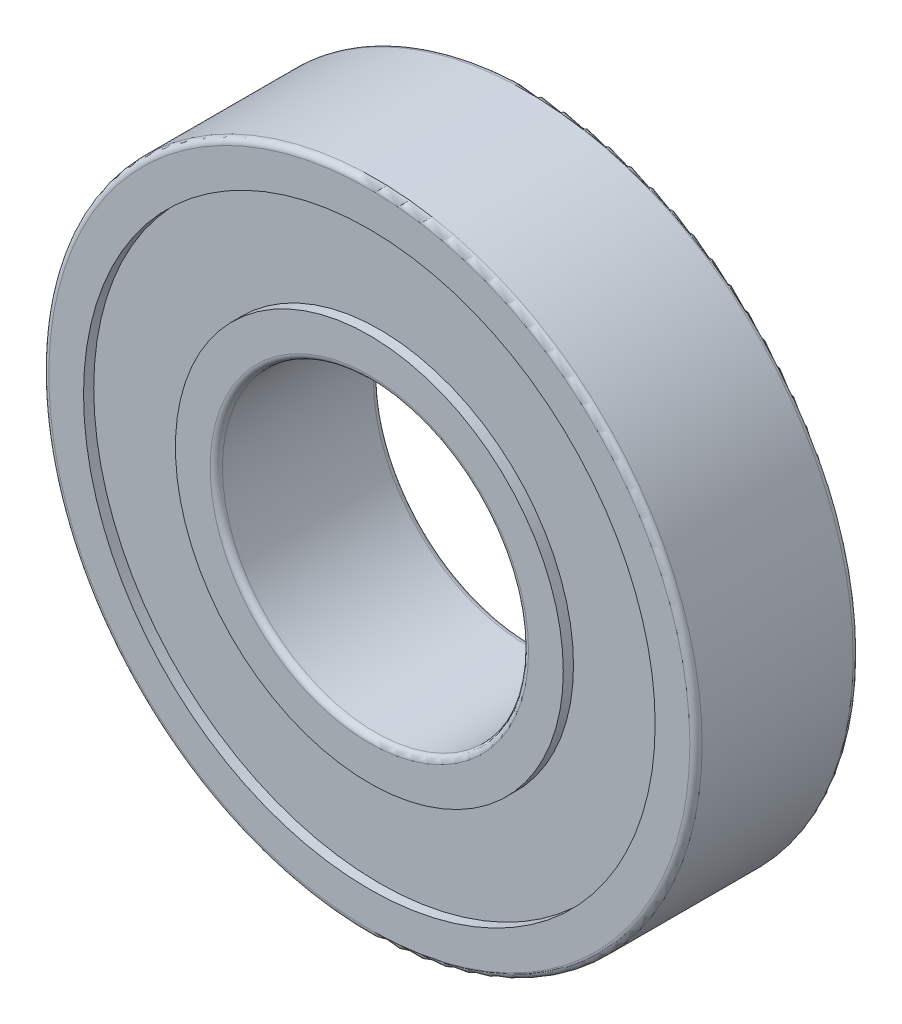
ISO-10303-21;
HEADER;
FILE_DESCRIPTION(('STEP AP214'),'2;1');
FILE_NAME('part.step','',(''),(''),'','','');
FILE_SCHEMA(('AUTOMOTIVE_DESIGN { 1 0 10303 214 1 1 1 1 }'));
ENDSEC;
DATA;
#1=APPLICATION_CONTEXT('core data for automotive mechanical design processes');
#2=APPLICATION_PROTOCOL_DEFINITION('international standard','automotive_design',2000,#1);
#3=PRODUCT_CONTEXT('',#1,'mechanical');
#4=PRODUCT('Part','Part','',(#3));
#5=PRODUCT_RELATED_PRODUCT_CATEGORY('part','',(#4));
#6=PRODUCT_DEFINITION_FORMATION('','',#4);
#7=PRODUCT_DEFINITION_CONTEXT('part definition',#1,'design');
#8=PRODUCT_DEFINITION('design','',#6,#7);
#9=PRODUCT_DEFINITION_SHAPE('','',#8);
#10=(LENGTH_UNIT() NAMED_UNIT(*) SI_UNIT(.MILLI.,.METRE.));
#11=(NAMED_UNIT(*) PLANE_ANGLE_UNIT() SI_UNIT($,.RADIAN.));
#12=(NAMED_UNIT(*) SI_UNIT($,.STERADIAN.) SOLID_ANGLE_UNIT());
#13=UNCERTAINTY_MEASURE_WITH_UNIT(LENGTH_MEASURE(1.E-05),#10,'distance_accuracy_value','');
#14=(GEOMETRIC_REPRESENTATION_CONTEXT(3) GLOBAL_UNCERTAINTY_ASSIGNED_CONTEXT((#13)) GLOBAL_UNIT_ASSIGNED_CONTEXT((#10,
#11,#12)) REPRESENTATION_CONTEXT('',''));
#15=CARTESIAN_POINT('',(0.,0.,0.));
#16=DIRECTION('',(0.,0.,1.));
#17=DIRECTION('',(1.,0.,0.));
#18=AXIS2_PLACEMENT_3D('',#15,#16,#17);
#19=CARTESIAN_POINT('',(0.,0.,-4.));
#20=DIRECTION('',(0.,0.,1.));
#21=DIRECTION('',(1.,0.,0.));
#22=AXIS2_PLACEMENT_3D('',#19,#20,#21);
#23=PLANE('',#22);
#24=CARTESIAN_POINT('',(0.,0.,-4.));
#25=DIRECTION('',(0.,0.,1.));
#26=DIRECTION('',(1.,0.,0.));
#27=AXIS2_PLACEMENT_3D('',#24,#25,#26);
#28=CIRCLE('',#27,7.8);
#29=CARTESIAN_POINT('',(7.8,0.,-4.));
#30=VERTEX_POINT('',#29);
#31=EDGE_CURVE('E92',#30,#30,#28,.T.);
#32=ORIENTED_EDGE('',*,*,#31,.T.);
#33=EDGE_LOOP('',(#32));
#34=FACE_BOUND('',#33,.T.);
#35=CARTESIAN_POINT('',(0.,0.,-4.));
#36=DIRECTION('',(0.,0.,1.));
#37=DIRECTION('',(1.,0.,0.));
#38=AXIS2_PLACEMENT_3D('',#35,#36,#37);
#39=CIRCLE('',#38,9.5);
#40=CARTESIAN_POINT('',(9.5,0.,-4.));
#41=VERTEX_POINT('',#40);
#42=EDGE_CURVE('E68',#41,#41,#39,.T.);
#43=ORIENTED_EDGE('',*,*,#42,.F.);
#44=EDGE_LOOP('',(#43));
#45=FACE_BOUND('',#44,.T.);
#46=ADVANCED_FACE('F57',(#34,#45),#23,.F.);
#47=CARTESIAN_POINT('',(0.,0.,-3.5));
#48=DIRECTION('',(0.,0.,-1.));
#49=DIRECTION('',(1.,0.,0.));
#50=AXIS2_PLACEMENT_3D('',#47,#48,#49);
#51=CYLINDRICAL_SURFACE('',#50,14.);
#52=CARTESIAN_POINT('',(0.,0.,-3.5));
#53=DIRECTION('',(0.,0.,1.));
#54=DIRECTION('',(1.,0.,0.));
#55=AXIS2_PLACEMENT_3D('',#52,#53,#54);
#56=CIRCLE('',#55,14.);
#57=CARTESIAN_POINT('',(14.,0.,-3.5));
#58=VERTEX_POINT('',#57);
#59=EDGE_CURVE('E64',#58,#58,#56,.T.);
#60=ORIENTED_EDGE('',*,*,#59,.T.);
#61=EDGE_LOOP('',(#60));
#62=FACE_BOUND('',#61,.T.);
#63=CARTESIAN_POINT('',(0.,0.,-4.));
#64=DIRECTION('',(0.,0.,1.));
#65=DIRECTION('',(1.,0.,0.));
#66=AXIS2_PLACEMENT_3D('',#63,#64,#65);
#67=CIRCLE('',#66,14.);
#68=CARTESIAN_POINT('',(14.,0.,-4.));
#69=VERTEX_POINT('',#68);
#70=EDGE_CURVE('E12',#69,#69,#67,.T.);
#71=ORIENTED_EDGE('',*,*,#70,.F.);
#72=EDGE_LOOP('',(#71));
#73=FACE_BOUND('',#72,.T.);
#74=ADVANCED_FACE('F59',(#62,#73),#51,.F.);
#75=CARTESIAN_POINT('',(0.,0.,-3.5));
#76=DIRECTION('',(0.,0.,-1.));
#77=DIRECTION('',(1.,0.,0.));
#78=AXIS2_PLACEMENT_3D('',#75,#76,#77);
#79=PLANE('',#78);
#80=CARTESIAN_POINT('',(0.,0.,-3.5));
#81=DIRECTION('',(0.,0.,1.));
#82=DIRECTION('',(1.,0.,0.));
#83=AXIS2_PLACEMENT_3D('',#80,#81,#82);
#84=CIRCLE('',#83,9.5);
#85=CARTESIAN_POINT('',(9.5,0.,-3.5));
#86=VERTEX_POINT('',#85);
#87=EDGE_CURVE('E72',#86,#86,#84,.T.);
#88=ORIENTED_EDGE('',*,*,#87,.T.);
#89=EDGE_LOOP('',(#88));
#90=FACE_BOUND('',#89,.T.);
#91=ORIENTED_EDGE('',*,*,#59,.F.);
#92=EDGE_LOOP('',(#91));
#93=FACE_BOUND('',#92,.T.);
#94=ADVANCED_FACE('F150',(#90,#93),#79,.T.);
#95=CARTESIAN_POINT('',(0.,0.,-3.5));
#96=DIRECTION('',(0.,0.,-1.));
#97=DIRECTION('',(1.,0.,0.));
#98=AXIS2_PLACEMENT_3D('',#95,#96,#97);
#99=CYLINDRICAL_SURFACE('',#98,9.5);
#100=ORIENTED_EDGE('',*,*,#87,.F.);
#101=EDGE_LOOP('',(#100));
#102=FACE_BOUND('',#101,.T.);
#103=ORIENTED_EDGE('',*,*,#42,.T.);
#104=EDGE_LOOP('',(#103));
#105=FACE_BOUND('',#104,.T.);
#106=ADVANCED_FACE('F142',(#102,#105),#99,.T.);
#107=CARTESIAN_POINT('',(0.,0.,4.));
#108=DIRECTION('',(0.,0.,1.));
#109=DIRECTION('',(1.,0.,0.));
#110=AXIS2_PLACEMENT_3D('',#107,#108,#109);
#111=PLANE('',#110);
#112=CARTESIAN_POINT('',(0.,0.,4.));
#113=DIRECTION('',(0.,0.,1.));
#114=DIRECTION('',(1.,0.,0.));
#115=AXIS2_PLACEMENT_3D('',#112,#113,#114);
#116=CIRCLE('',#115,7.8);
#117=CARTESIAN_POINT('',(7.8,0.,4.));
#118=VERTEX_POINT('',#117);
#119=EDGE_CURVE('E80',#118,#118,#116,.F.);
#120=ORIENTED_EDGE('',*,*,#119,.T.);
#121=EDGE_LOOP('',(#120));
#122=FACE_BOUND('',#121,.T.);
#123=CARTESIAN_POINT('',(0.,0.,4.));
#124=DIRECTION('',(0.,0.,1.));
#125=DIRECTION('',(1.,0.,0.));
#126=AXIS2_PLACEMENT_3D('',#123,#124,#125);
#127=CIRCLE('',#126,9.5);
#128=CARTESIAN_POINT('',(9.5,0.,4.));
#129=VERTEX_POINT('',#128);
#130=EDGE_CURVE('E108',#129,#129,#127,.T.);
#131=ORIENTED_EDGE('',*,*,#130,.T.);
#132=EDGE_LOOP('',(#131));
#133=FACE_BOUND('',#132,.T.);
#134=ADVANCED_FACE('F133',(#122,#133),#111,.T.);
#135=CARTESIAN_POINT('',(0.,0.,4.));
#136=DIRECTION('',(0.,0.,1.));
#137=DIRECTION('',(1.,0.,0.));
#138=AXIS2_PLACEMENT_3D('',#135,#136,#137);
#139=CIRCLE('',#138,15.7);
#140=CARTESIAN_POINT('',(15.7,0.,4.));
#141=VERTEX_POINT('',#140);
#142=EDGE_CURVE('E77',#141,#141,#139,.T.);
#143=ORIENTED_EDGE('',*,*,#142,.T.);
#144=EDGE_LOOP('',(#143));
#145=FACE_BOUND('',#144,.T.);
#146=CARTESIAN_POINT('',(0.,0.,4.));
#147=DIRECTION('',(0.,0.,1.));
#148=DIRECTION('',(1.,0.,0.));
#149=AXIS2_PLACEMENT_3D('',#146,#147,#148);
#150=CIRCLE('',#149,14.);
#151=CARTESIAN_POINT('',(14.,0.,4.));
#152=VERTEX_POINT('',#151);
#153=EDGE_CURVE('E102',#152,#152,#150,.T.);
#154=ORIENTED_EDGE('',*,*,#153,.F.);
#155=EDGE_LOOP('',(#154));
#156=FACE_BOUND('',#155,.T.);
#157=ADVANCED_FACE('F130',(#145,#156),#111,.T.);
#158=ORIENTED_EDGE('',*,*,#70,.T.);
#159=EDGE_LOOP('',(#158));
#160=FACE_BOUND('',#159,.T.);
#161=CARTESIAN_POINT('',(0.,0.,-4.));
#162=DIRECTION('',(0.,0.,1.));
#163=DIRECTION('',(1.,0.,0.));
#164=AXIS2_PLACEMENT_3D('',#161,#162,#163);
#165=CIRCLE('',#164,15.7);
#166=CARTESIAN_POINT('',(15.7,0.,-4.));
#167=VERTEX_POINT('',#166);
#168=EDGE_CURVE('E89',#167,#167,#165,.F.);
#169=ORIENTED_EDGE('',*,*,#168,.T.);
#170=EDGE_LOOP('',(#169));
#171=FACE_BOUND('',#170,.T.);
#172=ADVANCED_FACE('F132',(#160,#171),#23,.F.);
#173=CARTESIAN_POINT('',(0.,0.,4.));
#174=DIRECTION('',(0.,0.,-1.));
#175=DIRECTION('',(-1.,0.,0.));
#176=AXIS2_PLACEMENT_3D('',#173,#174,#175);
#177=CYLINDRICAL_SURFACE('',#176,16.);
#178=CARTESIAN_POINT('',(0.,0.,-3.7));
#179=DIRECTION('',(0.,0.,1.));
#180=DIRECTION('',(1.,0.,0.));
#181=AXIS2_PLACEMENT_3D('',#178,#179,#180);
#182=CIRCLE('',#181,16.);
#183=CARTESIAN_POINT('',(16.,0.,-3.7));
#184=VERTEX_POINT('',#183);
#185=EDGE_CURVE('E95',#184,#184,#182,.T.);
#186=ORIENTED_EDGE('',*,*,#185,.T.);
#187=EDGE_LOOP('',(#186));
#188=FACE_BOUND('',#187,.T.);
#189=CARTESIAN_POINT('',(0.,0.,3.7));
#190=DIRECTION('',(0.,0.,1.));
#191=DIRECTION('',(1.,0.,0.));
#192=AXIS2_PLACEMENT_3D('',#189,#190,#191);
#193=CIRCLE('',#192,16.);
#194=CARTESIAN_POINT('',(16.,0.,3.7));
#195=VERTEX_POINT('',#194);
#196=EDGE_CURVE('E98',#195,#195,#193,.F.);
#197=ORIENTED_EDGE('',*,*,#196,.T.);
#198=EDGE_LOOP('',(#197));
#199=FACE_BOUND('',#198,.T.);
#200=ADVANCED_FACE('F140',(#188,#199),#177,.T.);
#201=CARTESIAN_POINT('',(0.,0.,4.));
#202=DIRECTION('',(0.,0.,-1.));
#203=DIRECTION('',(-1.,0.,0.));
#204=AXIS2_PLACEMENT_3D('',#201,#202,#203);
#205=CYLINDRICAL_SURFACE('',#204,7.5);
#206=CARTESIAN_POINT('',(0.,0.,-3.7));
#207=DIRECTION('',(0.,0.,1.));
#208=DIRECTION('',(1.,0.,0.));
#209=AXIS2_PLACEMENT_3D('',#206,#207,#208);
#210=CIRCLE('',#209,7.5);
#211=CARTESIAN_POINT('',(7.5,0.,-3.7));
#212=VERTEX_POINT('',#211);
#213=EDGE_CURVE('E83',#212,#212,#210,.F.);
#214=ORIENTED_EDGE('',*,*,#213,.T.);
#215=EDGE_LOOP('',(#214));
#216=FACE_BOUND('',#215,.T.);
#217=CARTESIAN_POINT('',(0.,0.,3.7));
#218=DIRECTION('',(0.,0.,1.));
#219=DIRECTION('',(1.,0.,0.));
#220=AXIS2_PLACEMENT_3D('',#217,#218,#219);
#221=CIRCLE('',#220,7.5);
#222=CARTESIAN_POINT('',(7.5,0.,3.7));
#223=VERTEX_POINT('',#222);
#224=EDGE_CURVE('E86',#223,#223,#221,.T.);
#225=ORIENTED_EDGE('',*,*,#224,.T.);
#226=EDGE_LOOP('',(#225));
#227=FACE_BOUND('',#226,.T.);
#228=ADVANCED_FACE('F126',(#216,#227),#205,.F.);
#229=CARTESIAN_POINT('',(0.,0.,3.5));
#230=DIRECTION('',(0.,0.,1.));
#231=DIRECTION('',(1.,0.,0.));
#232=AXIS2_PLACEMENT_3D('',#229,#230,#231);
#233=CYLINDRICAL_SURFACE('',#232,14.);
#234=CARTESIAN_POINT('',(0.,0.,3.5));
#235=DIRECTION('',(0.,0.,1.));
#236=DIRECTION('',(1.,0.,0.));
#237=AXIS2_PLACEMENT_3D('',#234,#235,#236);
#238=CIRCLE('',#237,14.);
#239=CARTESIAN_POINT('',(14.,0.,3.5));
#240=VERTEX_POINT('',#239);
#241=EDGE_CURVE('E101',#240,#240,#238,.T.);
#242=ORIENTED_EDGE('',*,*,#241,.F.);
#243=EDGE_LOOP('',(#242));
#244=FACE_BOUND('',#243,.T.);
#245=ORIENTED_EDGE('',*,*,#153,.T.);
#246=EDGE_LOOP('',(#245));
#247=FACE_BOUND('',#246,.T.);
#248=ADVANCED_FACE('F120',(#244,#247),#233,.F.);
#249=CARTESIAN_POINT('',(0.,0.,3.5));
#250=DIRECTION('',(0.,0.,1.));
#251=DIRECTION('',(1.,0.,0.));
#252=AXIS2_PLACEMENT_3D('',#249,#250,#251);
#253=PLANE('',#252);
#254=CARTESIAN_POINT('',(0.,0.,3.5));
#255=DIRECTION('',(0.,0.,1.));
#256=DIRECTION('',(1.,0.,0.));
#257=AXIS2_PLACEMENT_3D('',#254,#255,#256);
#258=CIRCLE('',#257,9.5);
#259=CARTESIAN_POINT('',(9.5,0.,3.5));
#260=VERTEX_POINT('',#259);
#261=EDGE_CURVE('E105',#260,#260,#258,.T.);
#262=ORIENTED_EDGE('',*,*,#261,.F.);
#263=EDGE_LOOP('',(#262));
#264=FACE_BOUND('',#263,.T.);
#265=ORIENTED_EDGE('',*,*,#241,.T.);
#266=EDGE_LOOP('',(#265));
#267=FACE_BOUND('',#266,.T.);
#268=ADVANCED_FACE('F117',(#264,#267),#253,.T.);
#269=CARTESIAN_POINT('',(0.,0.,3.5));
#270=DIRECTION('',(0.,0.,1.));
#271=DIRECTION('',(1.,0.,0.));
#272=AXIS2_PLACEMENT_3D('',#269,#270,#271);
#273=CYLINDRICAL_SURFACE('',#272,9.5);
#274=ORIENTED_EDGE('',*,*,#261,.T.);
#275=EDGE_LOOP('',(#274));
#276=FACE_BOUND('',#275,.T.);
#277=ORIENTED_EDGE('',*,*,#130,.F.);
#278=EDGE_LOOP('',(#277));
#279=FACE_BOUND('',#278,.T.);
#280=ADVANCED_FACE('F114',(#276,#279),#273,.T.);
#281=CARTESIAN_POINT('',(0.,0.,-3.7));
#282=DIRECTION('',(0.,0.,1.));
#283=DIRECTION('',(1.,0.,0.));
#284=AXIS2_PLACEMENT_3D('',#281,#282,#283);
#285=TOROIDAL_SURFACE('',#284,15.7,0.3);
#286=ORIENTED_EDGE('',*,*,#168,.F.);
#287=EDGE_LOOP('',(#286));
#288=FACE_BOUND('',#287,.T.);
#289=ORIENTED_EDGE('',*,*,#185,.F.);
#290=EDGE_LOOP('',(#289));
#291=FACE_BOUND('',#290,.T.);
#292=ADVANCED_FACE('F156',(#288,#291),#285,.T.);
#293=CARTESIAN_POINT('',(0.,0.,-3.7));
#294=DIRECTION('',(0.,0.,1.));
#295=DIRECTION('',(1.,0.,0.));
#296=AXIS2_PLACEMENT_3D('',#293,#294,#295);
#297=TOROIDAL_SURFACE('',#296,7.8,0.3);
#298=ORIENTED_EDGE('',*,*,#213,.F.);
#299=EDGE_LOOP('',(#298));
#300=FACE_BOUND('',#299,.T.);
#301=ORIENTED_EDGE('',*,*,#31,.F.);
#302=EDGE_LOOP('',(#301));
#303=FACE_BOUND('',#302,.T.);
#304=ADVANCED_FACE('F159',(#300,#303),#297,.T.);
#305=CARTESIAN_POINT('',(0.,0.,3.7));
#306=DIRECTION('',(0.,0.,1.));
#307=DIRECTION('',(1.,0.,0.));
#308=AXIS2_PLACEMENT_3D('',#305,#306,#307);
#309=TOROIDAL_SURFACE('',#308,7.8,0.3);
#310=ORIENTED_EDGE('',*,*,#119,.F.);
#311=EDGE_LOOP('',(#310));
#312=FACE_BOUND('',#311,.T.);
#313=ORIENTED_EDGE('',*,*,#224,.F.);
#314=EDGE_LOOP('',(#313));
#315=FACE_BOUND('',#314,.T.);
#316=ADVANCED_FACE('F163',(#312,#315),#309,.T.);
#317=CARTESIAN_POINT('',(0.,0.,3.7));
#318=DIRECTION('',(0.,0.,1.));
#319=DIRECTION('',(1.,0.,0.));
#320=AXIS2_PLACEMENT_3D('',#317,#318,#319);
#321=TOROIDAL_SURFACE('',#320,15.7,0.3);
#322=ORIENTED_EDGE('',*,*,#196,.F.);
#323=EDGE_LOOP('',(#322));
#324=FACE_BOUND('',#323,.T.);
#325=ORIENTED_EDGE('',*,*,#142,.F.);
#326=EDGE_LOOP('',(#325));
#327=FACE_BOUND('',#326,.T.);
#328=ADVANCED_FACE('F167',(#324,#327),#321,.T.);
#329=CLOSED_SHELL('',(#46,#74,#94,#106,#134,#157,#172,#200,#228,#248,#268,#280,#292,#304,#316,#328));
#330=MANIFOLD_SOLID_BREP('B2',#329);
#331=ADVANCED_BREP_SHAPE_REPRESENTATION('',(#18,#330),#14);
#332=SHAPE_DEFINITION_REPRESENTATION(#9,#331);
ENDSEC;
END-ISO-10303-21;
